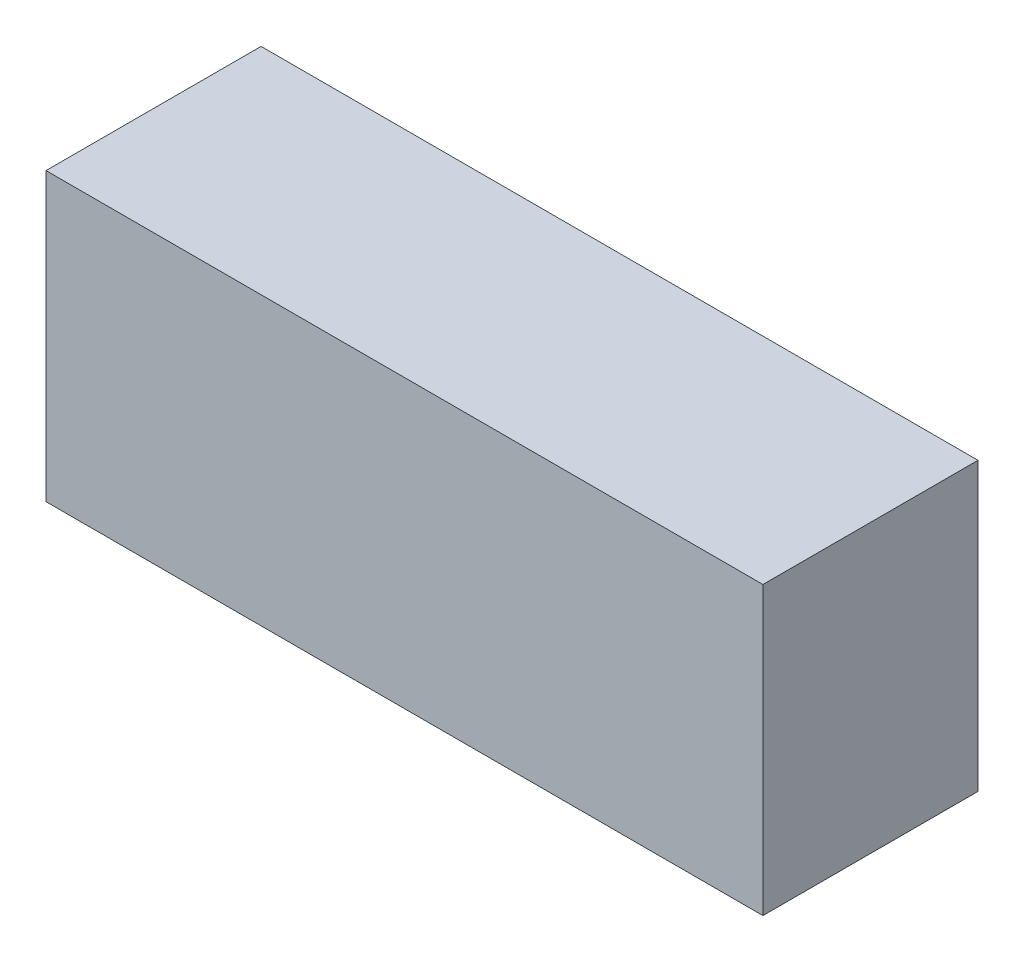
ISO-10303-21;
HEADER;
FILE_DESCRIPTION(('STEP AP214'),'2;1');
FILE_NAME('part.step','',(''),(''),'','','');
FILE_SCHEMA(('AUTOMOTIVE_DESIGN { 1 0 10303 214 1 1 1 1 }'));
ENDSEC;
DATA;
#1=APPLICATION_CONTEXT('core data for automotive mechanical design processes');
#2=APPLICATION_PROTOCOL_DEFINITION('international standard','automotive_design',2000,#1);
#3=PRODUCT_CONTEXT('',#1,'mechanical');
#4=PRODUCT('Part','Part','',(#3));
#5=PRODUCT_RELATED_PRODUCT_CATEGORY('part','',(#4));
#6=PRODUCT_DEFINITION_FORMATION('','',#4);
#7=PRODUCT_DEFINITION_CONTEXT('part definition',#1,'design');
#8=PRODUCT_DEFINITION('design','',#6,#7);
#9=PRODUCT_DEFINITION_SHAPE('','',#8);
#10=(LENGTH_UNIT() NAMED_UNIT(*) SI_UNIT(.MILLI.,.METRE.));
#11=(NAMED_UNIT(*) PLANE_ANGLE_UNIT() SI_UNIT($,.RADIAN.));
#12=(NAMED_UNIT(*) SI_UNIT($,.STERADIAN.) SOLID_ANGLE_UNIT());
#13=UNCERTAINTY_MEASURE_WITH_UNIT(LENGTH_MEASURE(1.E-05),#10,'distance_accuracy_value','');
#14=(GEOMETRIC_REPRESENTATION_CONTEXT(3) GLOBAL_UNCERTAINTY_ASSIGNED_CONTEXT((#13)) GLOBAL_UNIT_ASSIGNED_CONTEXT((#10,
#11,#12)) REPRESENTATION_CONTEXT('',''));
#15=CARTESIAN_POINT('',(0.,0.,0.));
#16=DIRECTION('',(0.,0.,1.));
#17=DIRECTION('',(1.,0.,0.));
#18=AXIS2_PLACEMENT_3D('',#15,#16,#17);
#19=CARTESIAN_POINT('',(-50.,20.,15.));
#20=DIRECTION('',(1.,0.,0.));
#21=DIRECTION('',(0.,0.,-1.));
#22=AXIS2_PLACEMENT_3D('',#19,#20,#21);
#23=PLANE('',#22);
#24=DIRECTION('',(0.,0.,1.));
#25=VECTOR('',#24,1.);
#26=CARTESIAN_POINT('',(-50.,-20.,15.));
#27=LINE('',#26,#25);
#28=CARTESIAN_POINT('',(-50.,-20.,-15.));
#29=VERTEX_POINT('',#28);
#30=CARTESIAN_POINT('',(-50.,-20.,15.));
#31=VERTEX_POINT('',#30);
#32=EDGE_CURVE('E95',#29,#31,#27,.T.);
#33=ORIENTED_EDGE('',*,*,#32,.T.);
#34=DIRECTION('',(0.,-1.,0.));
#35=VECTOR('',#34,1.);
#36=CARTESIAN_POINT('',(-50.,20.,15.));
#37=LINE('',#36,#35);
#38=CARTESIAN_POINT('',(-50.,20.,15.));
#39=VERTEX_POINT('',#38);
#40=EDGE_CURVE('E11',#39,#31,#37,.T.);
#41=ORIENTED_EDGE('',*,*,#40,.F.);
#42=DIRECTION('',(0.,0.,1.));
#43=VECTOR('',#42,1.);
#44=CARTESIAN_POINT('',(-50.,20.,15.));
#45=LINE('',#44,#43);
#46=CARTESIAN_POINT('',(-50.,20.,-15.));
#47=VERTEX_POINT('',#46);
#48=EDGE_CURVE('E83',#47,#39,#45,.T.);
#49=ORIENTED_EDGE('',*,*,#48,.F.);
#50=DIRECTION('',(0.,-1.,0.));
#51=VECTOR('',#50,1.);
#52=CARTESIAN_POINT('',(-50.,20.,-15.));
#53=LINE('',#52,#51);
#54=EDGE_CURVE('E91',#47,#29,#53,.T.);
#55=ORIENTED_EDGE('',*,*,#54,.T.);
#56=EDGE_LOOP('',(#33,#41,#49,#55));
#57=FACE_BOUND('',#56,.T.);
#58=ADVANCED_FACE('F32',(#57),#23,.F.);
#59=CARTESIAN_POINT('',(50.,20.,15.));
#60=DIRECTION('',(0.,0.,-1.));
#61=DIRECTION('',(-1.,0.,0.));
#62=AXIS2_PLACEMENT_3D('',#59,#60,#61);
#63=PLANE('',#62);
#64=DIRECTION('',(1.,0.,0.));
#65=VECTOR('',#64,1.);
#66=CARTESIAN_POINT('',(50.,-20.,15.));
#67=LINE('',#66,#65);
#68=CARTESIAN_POINT('',(50.,-20.,15.));
#69=VERTEX_POINT('',#68);
#70=EDGE_CURVE('E87',#31,#69,#67,.T.);
#71=ORIENTED_EDGE('',*,*,#70,.T.);
#72=DIRECTION('',(0.,-1.,0.));
#73=VECTOR('',#72,1.);
#74=CARTESIAN_POINT('',(50.,20.,15.));
#75=LINE('',#74,#73);
#76=CARTESIAN_POINT('',(50.,20.,15.));
#77=VERTEX_POINT('',#76);
#78=EDGE_CURVE('E40',#77,#69,#75,.T.);
#79=ORIENTED_EDGE('',*,*,#78,.F.);
#80=DIRECTION('',(1.,0.,0.));
#81=VECTOR('',#80,1.);
#82=CARTESIAN_POINT('',(50.,20.,15.));
#83=LINE('',#82,#81);
#84=EDGE_CURVE('E78',#39,#77,#83,.T.);
#85=ORIENTED_EDGE('',*,*,#84,.F.);
#86=ORIENTED_EDGE('',*,*,#40,.T.);
#87=EDGE_LOOP('',(#71,#79,#85,#86));
#88=FACE_BOUND('',#87,.T.);
#89=ADVANCED_FACE('F86',(#88),#63,.F.);
#90=CARTESIAN_POINT('',(50.,20.,15.));
#91=DIRECTION('',(-1.,0.,0.));
#92=DIRECTION('',(0.,0.,1.));
#93=AXIS2_PLACEMENT_3D('',#90,#91,#92);
#94=PLANE('',#93);
#95=DIRECTION('',(0.,0.,-1.));
#96=VECTOR('',#95,1.);
#97=CARTESIAN_POINT('',(50.,-20.,15.));
#98=LINE('',#97,#96);
#99=CARTESIAN_POINT('',(50.,-20.,-15.));
#100=VERTEX_POINT('',#99);
#101=EDGE_CURVE('E65',#69,#100,#98,.T.);
#102=ORIENTED_EDGE('',*,*,#101,.T.);
#103=DIRECTION('',(0.,-1.,0.));
#104=VECTOR('',#103,1.);
#105=CARTESIAN_POINT('',(50.,20.,-15.));
#106=LINE('',#105,#104);
#107=CARTESIAN_POINT('',(50.,20.,-15.));
#108=VERTEX_POINT('',#107);
#109=EDGE_CURVE('E88',#108,#100,#106,.T.);
#110=ORIENTED_EDGE('',*,*,#109,.F.);
#111=DIRECTION('',(0.,0.,-1.));
#112=VECTOR('',#111,1.);
#113=CARTESIAN_POINT('',(50.,20.,15.));
#114=LINE('',#113,#112);
#115=EDGE_CURVE('E81',#77,#108,#114,.T.);
#116=ORIENTED_EDGE('',*,*,#115,.F.);
#117=ORIENTED_EDGE('',*,*,#78,.T.);
#118=EDGE_LOOP('',(#102,#110,#116,#117));
#119=FACE_BOUND('',#118,.T.);
#120=ADVANCED_FACE('F89',(#119),#94,.F.);
#121=CARTESIAN_POINT('',(50.,20.,-15.));
#122=DIRECTION('',(0.,0.,1.));
#123=DIRECTION('',(1.,0.,0.));
#124=AXIS2_PLACEMENT_3D('',#121,#122,#123);
#125=PLANE('',#124);
#126=DIRECTION('',(-1.,0.,0.));
#127=VECTOR('',#126,1.);
#128=CARTESIAN_POINT('',(50.,-20.,-15.));
#129=LINE('',#128,#127);
#130=EDGE_CURVE('E71',#100,#29,#129,.T.);
#131=ORIENTED_EDGE('',*,*,#130,.T.);
#132=ORIENTED_EDGE('',*,*,#54,.F.);
#133=DIRECTION('',(-1.,0.,0.));
#134=VECTOR('',#133,1.);
#135=CARTESIAN_POINT('',(50.,20.,-15.));
#136=LINE('',#135,#134);
#137=EDGE_CURVE('E48',#108,#47,#136,.T.);
#138=ORIENTED_EDGE('',*,*,#137,.F.);
#139=ORIENTED_EDGE('',*,*,#109,.T.);
#140=EDGE_LOOP('',(#131,#132,#138,#139));
#141=FACE_BOUND('',#140,.T.);
#142=ADVANCED_FACE('F102',(#141),#125,.F.);
#143=CARTESIAN_POINT('',(0.,20.,0.));
#144=DIRECTION('',(0.,1.,0.));
#145=DIRECTION('',(0.,0.,1.));
#146=AXIS2_PLACEMENT_3D('',#143,#144,#145);
#147=PLANE('',#146);
#148=ORIENTED_EDGE('',*,*,#48,.T.);
#149=ORIENTED_EDGE('',*,*,#84,.T.);
#150=ORIENTED_EDGE('',*,*,#115,.T.);
#151=ORIENTED_EDGE('',*,*,#137,.T.);
#152=EDGE_LOOP('',(#148,#149,#150,#151));
#153=FACE_BOUND('',#152,.T.);
#154=ADVANCED_FACE('F79',(#153),#147,.T.);
#155=CARTESIAN_POINT('',(0.,-20.,0.));
#156=DIRECTION('',(0.,1.,0.));
#157=DIRECTION('',(0.,0.,1.));
#158=AXIS2_PLACEMENT_3D('',#155,#156,#157);
#159=PLANE('',#158);
#160=ORIENTED_EDGE('',*,*,#32,.F.);
#161=ORIENTED_EDGE('',*,*,#130,.F.);
#162=ORIENTED_EDGE('',*,*,#101,.F.);
#163=ORIENTED_EDGE('',*,*,#70,.F.);
#164=EDGE_LOOP('',(#160,#161,#162,#163));
#165=FACE_BOUND('',#164,.T.);
#166=ADVANCED_FACE('F105',(#165),#159,.F.);
#167=CLOSED_SHELL('',(#58,#89,#120,#142,#154,#166));
#168=MANIFOLD_SOLID_BREP('B2',#167);
#169=ADVANCED_BREP_SHAPE_REPRESENTATION('',(#18,#168),#14);
#170=SHAPE_DEFINITION_REPRESENTATION(#9,#169);
ENDSEC;
END-ISO-10303-21;
